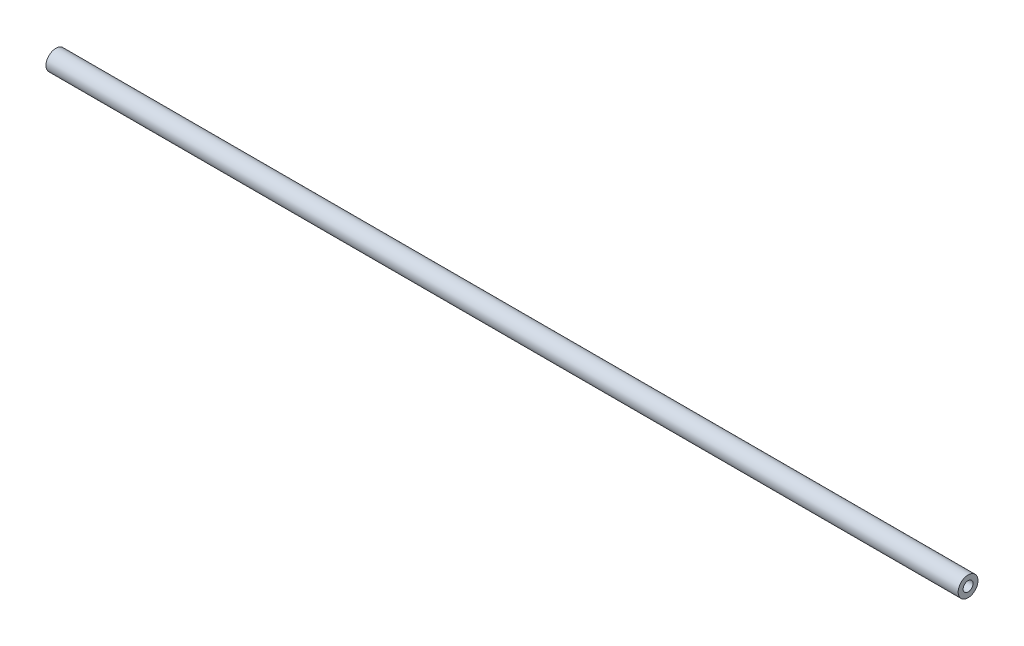
ISO-10303-21;
HEADER;
FILE_DESCRIPTION(('STEP AP214'),'2;1');
FILE_NAME('part.step','',(''),(''),'','','');
FILE_SCHEMA(('AUTOMOTIVE_DESIGN { 1 0 10303 214 1 1 1 1 }'));
ENDSEC;
DATA;
#1=APPLICATION_CONTEXT('core data for automotive mechanical design processes');
#2=APPLICATION_PROTOCOL_DEFINITION('international standard','automotive_design',2000,#1);
#3=PRODUCT_CONTEXT('',#1,'mechanical');
#4=PRODUCT('Part','Part','',(#3));
#5=PRODUCT_RELATED_PRODUCT_CATEGORY('part','',(#4));
#6=PRODUCT_DEFINITION_FORMATION('','',#4);
#7=PRODUCT_DEFINITION_CONTEXT('part definition',#1,'design');
#8=PRODUCT_DEFINITION('design','',#6,#7);
#9=PRODUCT_DEFINITION_SHAPE('','',#8);
#10=(LENGTH_UNIT() NAMED_UNIT(*) SI_UNIT(.MILLI.,.METRE.));
#11=(NAMED_UNIT(*) PLANE_ANGLE_UNIT() SI_UNIT($,.RADIAN.));
#12=(NAMED_UNIT(*) SI_UNIT($,.STERADIAN.) SOLID_ANGLE_UNIT());
#13=UNCERTAINTY_MEASURE_WITH_UNIT(LENGTH_MEASURE(1.E-05),#10,'distance_accuracy_value','');
#14=(GEOMETRIC_REPRESENTATION_CONTEXT(3) GLOBAL_UNCERTAINTY_ASSIGNED_CONTEXT((#13)) GLOBAL_UNIT_ASSIGNED_CONTEXT((#10,
#11,#12)) REPRESENTATION_CONTEXT('',''));
#15=CARTESIAN_POINT('',(0.,0.,0.));
#16=DIRECTION('',(0.,0.,1.));
#17=DIRECTION('',(1.,0.,0.));
#18=AXIS2_PLACEMENT_3D('',#15,#16,#17);
#19=CARTESIAN_POINT('',(146.05,0.,0.));
#20=DIRECTION('',(1.,0.,0.));
#21=DIRECTION('',(0.,0.,-1.));
#22=AXIS2_PLACEMENT_3D('',#19,#20,#21);
#23=PLANE('',#22);
#24=CARTESIAN_POINT('',(146.05,0.,0.));
#25=DIRECTION('',(1.,0.,0.));
#26=DIRECTION('',(0.,0.,-1.));
#27=AXIS2_PLACEMENT_3D('',#24,#25,#26);
#28=CIRCLE('',#27,1.5875);
#29=CARTESIAN_POINT('',(146.05,0.,-1.5875));
#30=VERTEX_POINT('',#29);
#31=EDGE_CURVE('E10',#30,#30,#28,.T.);
#32=ORIENTED_EDGE('',*,*,#31,.T.);
#33=EDGE_LOOP('',(#32));
#34=FACE_BOUND('',#33,.T.);
#35=CARTESIAN_POINT('',(146.05,0.,0.));
#36=DIRECTION('',(1.,0.,0.));
#37=DIRECTION('',(0.,0.,-1.));
#38=AXIS2_PLACEMENT_3D('',#35,#36,#37);
#39=CIRCLE('',#38,0.79375);
#40=CARTESIAN_POINT('',(146.05,0.,-0.79375));
#41=VERTEX_POINT('',#40);
#42=EDGE_CURVE('E48',#41,#41,#39,.T.);
#43=ORIENTED_EDGE('',*,*,#42,.F.);
#44=EDGE_LOOP('',(#43));
#45=FACE_BOUND('',#44,.T.);
#46=ADVANCED_FACE('F40',(#34,#45),#23,.T.);
#47=CARTESIAN_POINT('',(0.,0.,0.));
#48=DIRECTION('',(1.,0.,0.));
#49=DIRECTION('',(0.,0.,-1.));
#50=AXIS2_PLACEMENT_3D('',#47,#48,#49);
#51=PLANE('',#50);
#52=CARTESIAN_POINT('',(0.,0.,0.));
#53=DIRECTION('',(1.,0.,0.));
#54=DIRECTION('',(0.,0.,-1.));
#55=AXIS2_PLACEMENT_3D('',#52,#53,#54);
#56=CIRCLE('',#55,1.5875);
#57=CARTESIAN_POINT('',(0.,0.,-1.5875));
#58=VERTEX_POINT('',#57);
#59=EDGE_CURVE('E41',#58,#58,#56,.T.);
#60=ORIENTED_EDGE('',*,*,#59,.F.);
#61=EDGE_LOOP('',(#60));
#62=FACE_BOUND('',#61,.T.);
#63=CARTESIAN_POINT('',(0.,0.,0.));
#64=DIRECTION('',(1.,0.,0.));
#65=DIRECTION('',(0.,0.,-1.));
#66=AXIS2_PLACEMENT_3D('',#63,#64,#65);
#67=CIRCLE('',#66,0.79375);
#68=CARTESIAN_POINT('',(0.,0.,-0.79375));
#69=VERTEX_POINT('',#68);
#70=EDGE_CURVE('E49',#69,#69,#67,.T.);
#71=ORIENTED_EDGE('',*,*,#70,.T.);
#72=EDGE_LOOP('',(#71));
#73=FACE_BOUND('',#72,.T.);
#74=ADVANCED_FACE('F58',(#62,#73),#51,.F.);
#75=CARTESIAN_POINT('',(146.05,0.,0.));
#76=DIRECTION('',(-1.,0.,0.));
#77=DIRECTION('',(0.,0.,1.));
#78=AXIS2_PLACEMENT_3D('',#75,#76,#77);
#79=CYLINDRICAL_SURFACE('',#78,1.5875);
#80=ORIENTED_EDGE('',*,*,#31,.F.);
#81=EDGE_LOOP('',(#80));
#82=FACE_BOUND('',#81,.T.);
#83=ORIENTED_EDGE('',*,*,#59,.T.);
#84=EDGE_LOOP('',(#83));
#85=FACE_BOUND('',#84,.T.);
#86=ADVANCED_FACE('F39',(#82,#85),#79,.T.);
#87=CARTESIAN_POINT('',(146.05,0.,0.));
#88=DIRECTION('',(-1.,0.,0.));
#89=DIRECTION('',(0.,0.,1.));
#90=AXIS2_PLACEMENT_3D('',#87,#88,#89);
#91=CYLINDRICAL_SURFACE('',#90,0.79375);
#92=ORIENTED_EDGE('',*,*,#42,.T.);
#93=EDGE_LOOP('',(#92));
#94=FACE_BOUND('',#93,.T.);
#95=ORIENTED_EDGE('',*,*,#70,.F.);
#96=EDGE_LOOP('',(#95));
#97=FACE_BOUND('',#96,.T.);
#98=ADVANCED_FACE('F57',(#94,#97),#91,.F.);
#99=CLOSED_SHELL('',(#46,#74,#86,#98));
#100=MANIFOLD_SOLID_BREP('B2',#99);
#101=ADVANCED_BREP_SHAPE_REPRESENTATION('',(#18,#100),#14);
#102=SHAPE_DEFINITION_REPRESENTATION(#9,#101);
ENDSEC;
END-ISO-10303-21;
